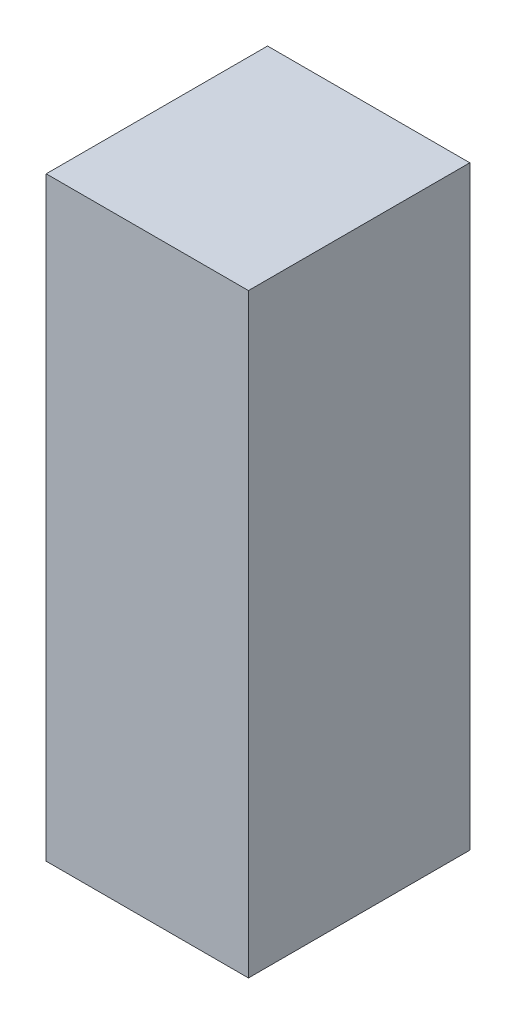
ISO-10303-21;
HEADER;
FILE_DESCRIPTION(('STEP AP214'),'2;1');
FILE_NAME('part.step','',(''),(''),'','','');
FILE_SCHEMA(('AUTOMOTIVE_DESIGN { 1 0 10303 214 1 1 1 1 }'));
ENDSEC;
DATA;
#1=APPLICATION_CONTEXT('core data for automotive mechanical design processes');
#2=APPLICATION_PROTOCOL_DEFINITION('international standard','automotive_design',2000,#1);
#3=PRODUCT_CONTEXT('',#1,'mechanical');
#4=PRODUCT('Part','Part','',(#3));
#5=PRODUCT_RELATED_PRODUCT_CATEGORY('part','',(#4));
#6=PRODUCT_DEFINITION_FORMATION('','',#4);
#7=PRODUCT_DEFINITION_CONTEXT('part definition',#1,'design');
#8=PRODUCT_DEFINITION('design','',#6,#7);
#9=PRODUCT_DEFINITION_SHAPE('','',#8);
#10=(LENGTH_UNIT() NAMED_UNIT(*) SI_UNIT(.MILLI.,.METRE.));
#11=(NAMED_UNIT(*) PLANE_ANGLE_UNIT() SI_UNIT($,.RADIAN.));
#12=(NAMED_UNIT(*) SI_UNIT($,.STERADIAN.) SOLID_ANGLE_UNIT());
#13=UNCERTAINTY_MEASURE_WITH_UNIT(LENGTH_MEASURE(1.E-05),#10,'distance_accuracy_value','');
#14=(GEOMETRIC_REPRESENTATION_CONTEXT(3) GLOBAL_UNCERTAINTY_ASSIGNED_CONTEXT((#13)) GLOBAL_UNIT_ASSIGNED_CONTEXT((#10,
#11,#12)) REPRESENTATION_CONTEXT('',''));
#15=CARTESIAN_POINT('',(0.,0.,0.));
#16=DIRECTION('',(0.,0.,1.));
#17=DIRECTION('',(1.,0.,0.));
#18=AXIS2_PLACEMENT_3D('',#15,#16,#17);
#19=CARTESIAN_POINT('',(3.3655,-9.906,0.));
#20=DIRECTION('',(-1.,0.,0.));
#21=DIRECTION('',(0.,0.,1.));
#22=AXIS2_PLACEMENT_3D('',#19,#20,#21);
#23=PLANE('',#22);
#24=DIRECTION('',(0.,0.,-1.));
#25=VECTOR('',#24,1.);
#26=CARTESIAN_POINT('',(3.3655,9.906,0.));
#27=LINE('',#26,#25);
#28=CARTESIAN_POINT('',(3.3655,9.906,0.));
#29=VERTEX_POINT('',#28);
#30=CARTESIAN_POINT('',(3.3655,9.906,7.366));
#31=VERTEX_POINT('',#30);
#32=EDGE_CURVE('E20',#29,#31,#27,.F.);
#33=ORIENTED_EDGE('',*,*,#32,.T.);
#34=DIRECTION('',(0.,1.,0.));
#35=VECTOR('',#34,1.);
#36=CARTESIAN_POINT('',(3.3655,9.906,7.366));
#37=LINE('',#36,#35);
#38=CARTESIAN_POINT('',(3.3655,-9.906,7.366));
#39=VERTEX_POINT('',#38);
#40=EDGE_CURVE('E55',#31,#39,#37,.F.);
#41=ORIENTED_EDGE('',*,*,#40,.T.);
#42=DIRECTION('',(0.,0.,1.));
#43=VECTOR('',#42,1.);
#44=CARTESIAN_POINT('',(3.3655,-9.906,0.));
#45=LINE('',#44,#43);
#46=CARTESIAN_POINT('',(3.3655,-9.906,0.));
#47=VERTEX_POINT('',#46);
#48=EDGE_CURVE('E74',#39,#47,#45,.F.);
#49=ORIENTED_EDGE('',*,*,#48,.T.);
#50=DIRECTION('',(0.,1.,0.));
#51=VECTOR('',#50,1.);
#52=CARTESIAN_POINT('',(3.3655,9.906,0.));
#53=LINE('',#52,#51);
#54=EDGE_CURVE('E66',#29,#47,#53,.F.);
#55=ORIENTED_EDGE('',*,*,#54,.F.);
#56=EDGE_LOOP('',(#33,#41,#49,#55));
#57=FACE_BOUND('',#56,.T.);
#58=ADVANCED_FACE('F17',(#57),#23,.F.);
#59=CARTESIAN_POINT('',(3.3655,9.906,0.));
#60=DIRECTION('',(0.,-1.,0.));
#61=DIRECTION('',(0.,0.,-1.));
#62=AXIS2_PLACEMENT_3D('',#59,#60,#61);
#63=PLANE('',#62);
#64=DIRECTION('',(0.,0.,-1.));
#65=VECTOR('',#64,1.);
#66=CARTESIAN_POINT('',(-3.3655,9.906,0.));
#67=LINE('',#66,#65);
#68=CARTESIAN_POINT('',(-3.3655,9.906,0.));
#69=VERTEX_POINT('',#68);
#70=CARTESIAN_POINT('',(-3.3655,9.906,7.366));
#71=VERTEX_POINT('',#70);
#72=EDGE_CURVE('E72',#69,#71,#67,.F.);
#73=ORIENTED_EDGE('',*,*,#72,.T.);
#74=DIRECTION('',(-1.,0.,0.));
#75=VECTOR('',#74,1.);
#76=CARTESIAN_POINT('',(3.3655,9.906,7.366));
#77=LINE('',#76,#75);
#78=EDGE_CURVE('E62',#71,#31,#77,.F.);
#79=ORIENTED_EDGE('',*,*,#78,.T.);
#80=ORIENTED_EDGE('',*,*,#32,.F.);
#81=DIRECTION('',(-1.,0.,0.));
#82=VECTOR('',#81,1.);
#83=CARTESIAN_POINT('',(3.3655,9.906,0.));
#84=LINE('',#83,#82);
#85=EDGE_CURVE('E80',#69,#29,#84,.F.);
#86=ORIENTED_EDGE('',*,*,#85,.F.);
#87=EDGE_LOOP('',(#73,#79,#80,#86));
#88=FACE_BOUND('',#87,.T.);
#89=ADVANCED_FACE('F71',(#88),#63,.F.);
#90=CARTESIAN_POINT('',(3.3655,9.906,7.366));
#91=DIRECTION('',(0.,0.,-1.));
#92=DIRECTION('',(-1.,0.,0.));
#93=AXIS2_PLACEMENT_3D('',#90,#91,#92);
#94=PLANE('',#93);
#95=DIRECTION('',(0.,1.,0.));
#96=VECTOR('',#95,1.);
#97=CARTESIAN_POINT('',(-3.3655,9.906,7.366));
#98=LINE('',#97,#96);
#99=CARTESIAN_POINT('',(-3.3655,-9.906,7.366));
#100=VERTEX_POINT('',#99);
#101=EDGE_CURVE('E83',#71,#100,#98,.F.);
#102=ORIENTED_EDGE('',*,*,#101,.T.);
#103=DIRECTION('',(1.,0.,0.));
#104=VECTOR('',#103,1.);
#105=CARTESIAN_POINT('',(-3.3655,-9.906,7.366));
#106=LINE('',#105,#104);
#107=EDGE_CURVE('E64',#100,#39,#106,.T.);
#108=ORIENTED_EDGE('',*,*,#107,.T.);
#109=ORIENTED_EDGE('',*,*,#40,.F.);
#110=ORIENTED_EDGE('',*,*,#78,.F.);
#111=EDGE_LOOP('',(#102,#108,#109,#110));
#112=FACE_BOUND('',#111,.T.);
#113=ADVANCED_FACE('F60',(#112),#94,.F.);
#114=CARTESIAN_POINT('',(-3.3655,-9.906,0.));
#115=DIRECTION('',(0.,1.,0.));
#116=DIRECTION('',(0.,0.,1.));
#117=AXIS2_PLACEMENT_3D('',#114,#115,#116);
#118=PLANE('',#117);
#119=ORIENTED_EDGE('',*,*,#48,.F.);
#120=ORIENTED_EDGE('',*,*,#107,.F.);
#121=DIRECTION('',(0.,0.,-1.));
#122=VECTOR('',#121,1.);
#123=CARTESIAN_POINT('',(-3.3655,-9.906,0.));
#124=LINE('',#123,#122);
#125=CARTESIAN_POINT('',(-3.3655,-9.906,0.));
#126=VERTEX_POINT('',#125);
#127=EDGE_CURVE('E26',#100,#126,#124,.T.);
#128=ORIENTED_EDGE('',*,*,#127,.T.);
#129=DIRECTION('',(-1.,0.,0.));
#130=VECTOR('',#129,1.);
#131=CARTESIAN_POINT('',(3.3655,-9.906,0.));
#132=LINE('',#131,#130);
#133=EDGE_CURVE('E34',#47,#126,#132,.T.);
#134=ORIENTED_EDGE('',*,*,#133,.F.);
#135=EDGE_LOOP('',(#119,#120,#128,#134));
#136=FACE_BOUND('',#135,.T.);
#137=ADVANCED_FACE('F88',(#136),#118,.F.);
#138=CARTESIAN_POINT('',(3.3655,9.906,0.));
#139=DIRECTION('',(0.,0.,-1.));
#140=DIRECTION('',(-1.,0.,0.));
#141=AXIS2_PLACEMENT_3D('',#138,#139,#140);
#142=PLANE('',#141);
#143=DIRECTION('',(0.,1.,0.));
#144=VECTOR('',#143,1.);
#145=CARTESIAN_POINT('',(-3.3655,9.906,0.));
#146=LINE('',#145,#144);
#147=EDGE_CURVE('E11',#126,#69,#146,.T.);
#148=ORIENTED_EDGE('',*,*,#147,.T.);
#149=ORIENTED_EDGE('',*,*,#85,.T.);
#150=ORIENTED_EDGE('',*,*,#54,.T.);
#151=ORIENTED_EDGE('',*,*,#133,.T.);
#152=EDGE_LOOP('',(#148,#149,#150,#151));
#153=FACE_BOUND('',#152,.T.);
#154=ADVANCED_FACE('F91',(#153),#142,.T.);
#155=CARTESIAN_POINT('',(-3.3655,9.906,0.));
#156=DIRECTION('',(1.,0.,0.));
#157=DIRECTION('',(0.,0.,-1.));
#158=AXIS2_PLACEMENT_3D('',#155,#156,#157);
#159=PLANE('',#158);
#160=ORIENTED_EDGE('',*,*,#127,.F.);
#161=ORIENTED_EDGE('',*,*,#101,.F.);
#162=ORIENTED_EDGE('',*,*,#72,.F.);
#163=ORIENTED_EDGE('',*,*,#147,.F.);
#164=EDGE_LOOP('',(#160,#161,#162,#163));
#165=FACE_BOUND('',#164,.T.);
#166=ADVANCED_FACE('F90',(#165),#159,.F.);
#167=CLOSED_SHELL('',(#58,#89,#113,#137,#154,#166));
#168=MANIFOLD_SOLID_BREP('B1',#167);
#169=ADVANCED_BREP_SHAPE_REPRESENTATION('',(#18,#168),#14);
#170=SHAPE_DEFINITION_REPRESENTATION(#9,#169);
ENDSEC;
END-ISO-10303-21;
